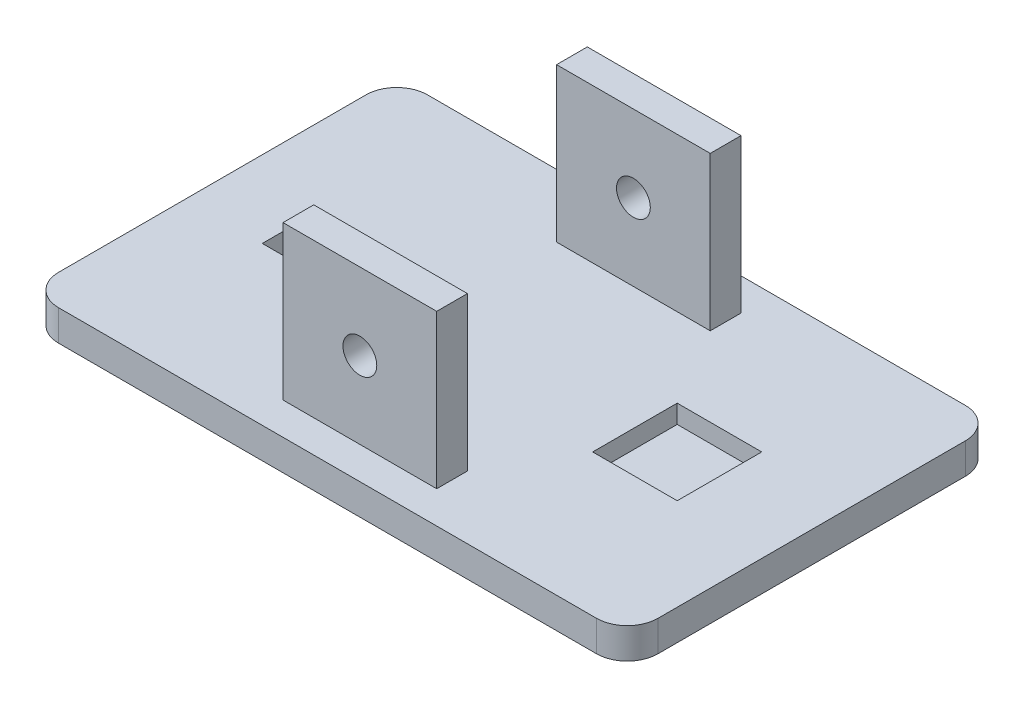
ISO-10303-21;
HEADER;
FILE_DESCRIPTION(('STEP AP214'),'2;1');
FILE_NAME('part.step','',(''),(''),'','','');
FILE_SCHEMA(('AUTOMOTIVE_DESIGN { 1 0 10303 214 1 1 1 1 }'));
ENDSEC;
DATA;
#1=APPLICATION_CONTEXT('core data for automotive mechanical design processes');
#2=APPLICATION_PROTOCOL_DEFINITION('international standard','automotive_design',2000,#1);
#3=PRODUCT_CONTEXT('',#1,'mechanical');
#4=PRODUCT('Part','Part','',(#3));
#5=PRODUCT_RELATED_PRODUCT_CATEGORY('part','',(#4));
#6=PRODUCT_DEFINITION_FORMATION('','',#4);
#7=PRODUCT_DEFINITION_CONTEXT('part definition',#1,'design');
#8=PRODUCT_DEFINITION('design','',#6,#7);
#9=PRODUCT_DEFINITION_SHAPE('','',#8);
#10=(LENGTH_UNIT() NAMED_UNIT(*) SI_UNIT(.MILLI.,.METRE.));
#11=(NAMED_UNIT(*) PLANE_ANGLE_UNIT() SI_UNIT($,.RADIAN.));
#12=(NAMED_UNIT(*) SI_UNIT($,.STERADIAN.) SOLID_ANGLE_UNIT());
#13=UNCERTAINTY_MEASURE_WITH_UNIT(LENGTH_MEASURE(1.E-05),#10,'distance_accuracy_value','');
#14=(GEOMETRIC_REPRESENTATION_CONTEXT(3) GLOBAL_UNCERTAINTY_ASSIGNED_CONTEXT((#13)) GLOBAL_UNIT_ASSIGNED_CONTEXT((#10,
#11,#12)) REPRESENTATION_CONTEXT('',''));
#15=CARTESIAN_POINT('',(0.,0.,0.));
#16=DIRECTION('',(0.,0.,1.));
#17=DIRECTION('',(1.,0.,0.));
#18=AXIS2_PLACEMENT_3D('',#15,#16,#17);
#19=CARTESIAN_POINT('',(-12.7383720930233,2.,13.3837209302326));
#20=DIRECTION('',(0.,1.,0.));
#21=DIRECTION('',(0.,0.,1.));
#22=AXIS2_PLACEMENT_3D('',#19,#20,#21);
#23=PLANE('',#22);
#24=DIRECTION('',(0.,0.,1.));
#25=VECTOR('',#24,1.);
#26=CARTESIAN_POINT('',(12.7616279069767,2.,0.633720930232558));
#27=LINE('',#26,#25);
#28=CARTESIAN_POINT('',(12.7616279069767,2.,0.633720930232558));
#29=VERTEX_POINT('',#28);
#30=CARTESIAN_POINT('',(12.7616279069767,2.,6.13372093023256));
#31=VERTEX_POINT('',#30);
#32=EDGE_CURVE('E48',#29,#31,#27,.T.);
#33=ORIENTED_EDGE('',*,*,#32,.F.);
#34=DIRECTION('',(-1.,0.,0.));
#35=VECTOR('',#34,1.);
#36=CARTESIAN_POINT('',(12.7616279069767,2.,0.633720930232558));
#37=LINE('',#36,#35);
#38=CARTESIAN_POINT('',(18.2616279069767,2.,0.633720930232558));
#39=VERTEX_POINT('',#38);
#40=EDGE_CURVE('E215',#39,#29,#37,.T.);
#41=ORIENTED_EDGE('',*,*,#40,.F.);
#42=DIRECTION('',(0.,0.,-1.));
#43=VECTOR('',#42,1.);
#44=CARTESIAN_POINT('',(18.2616279069767,2.,0.633720930232558));
#45=LINE('',#44,#43);
#46=CARTESIAN_POINT('',(18.2616279069767,2.,6.13372093023256));
#47=VERTEX_POINT('',#46);
#48=EDGE_CURVE('E218',#47,#39,#45,.T.);
#49=ORIENTED_EDGE('',*,*,#48,.F.);
#50=DIRECTION('',(1.,0.,0.));
#51=VECTOR('',#50,1.);
#52=CARTESIAN_POINT('',(12.7616279069767,2.,6.13372093023256));
#53=LINE('',#52,#51);
#54=EDGE_CURVE('E224',#31,#47,#53,.T.);
#55=ORIENTED_EDGE('',*,*,#54,.F.);
#56=EDGE_LOOP('',(#33,#41,#49,#55));
#57=FACE_BOUND('',#56,.T.);
#58=DIRECTION('',(0.,0.,1.));
#59=VECTOR('',#58,1.);
#60=CARTESIAN_POINT('',(-9.73837209302325,2.,1.63372093023256));
#61=LINE('',#60,#59);
#62=CARTESIAN_POINT('',(-9.73837209302325,2.,1.63372093023256));
#63=VERTEX_POINT('',#62);
#64=CARTESIAN_POINT('',(-9.73837209302325,2.,5.13372093023256));
#65=VERTEX_POINT('',#64);
#66=EDGE_CURVE('E56',#63,#65,#61,.T.);
#67=ORIENTED_EDGE('',*,*,#66,.F.);
#68=DIRECTION('',(-1.,0.,0.));
#69=VECTOR('',#68,1.);
#70=CARTESIAN_POINT('',(-9.73837209302325,2.,1.63372093023256));
#71=LINE('',#70,#69);
#72=CARTESIAN_POINT('',(-1.73837209302325,2.,1.63372093023256));
#73=VERTEX_POINT('',#72);
#74=EDGE_CURVE('E240',#73,#63,#71,.T.);
#75=ORIENTED_EDGE('',*,*,#74,.F.);
#76=DIRECTION('',(0.,0.,-1.));
#77=VECTOR('',#76,1.);
#78=CARTESIAN_POINT('',(-1.73837209302325,2.,1.63372093023256));
#79=LINE('',#78,#77);
#80=CARTESIAN_POINT('',(-1.73837209302325,2.,5.13372093023256));
#81=VERTEX_POINT('',#80);
#82=EDGE_CURVE('E237',#81,#73,#79,.T.);
#83=ORIENTED_EDGE('',*,*,#82,.F.);
#84=DIRECTION('',(1.,0.,0.));
#85=VECTOR('',#84,1.);
#86=CARTESIAN_POINT('',(-9.73837209302325,2.,5.13372093023256));
#87=LINE('',#86,#85);
#88=EDGE_CURVE('E234',#65,#81,#87,.T.);
#89=ORIENTED_EDGE('',*,*,#88,.F.);
#90=EDGE_LOOP('',(#67,#75,#83,#89));
#91=FACE_BOUND('',#90,.T.);
#92=CARTESIAN_POINT('',(-12.7383720930233,2.,13.3837209302326));
#93=DIRECTION('',(0.,1.,0.));
#94=DIRECTION('',(0.,0.,1.));
#95=AXIS2_PLACEMENT_3D('',#92,#93,#94);
#96=CIRCLE('',#95,2.);
#97=CARTESIAN_POINT('',(-14.7383720930233,2.,13.3837209302325));
#98=VERTEX_POINT('',#97);
#99=CARTESIAN_POINT('',(-12.7383720930232,2.,15.3837209302326));
#100=VERTEX_POINT('',#99);
#101=EDGE_CURVE('E320',#98,#100,#96,.T.);
#102=ORIENTED_EDGE('',*,*,#101,.T.);
#103=DIRECTION('',(1.,0.,0.));
#104=VECTOR('',#103,1.);
#105=CARTESIAN_POINT('',(-12.7383720930232,2.,15.3837209302326));
#106=LINE('',#105,#104);
#107=CARTESIAN_POINT('',(22.2616279069767,2.,15.3837209302326));
#108=VERTEX_POINT('',#107);
#109=EDGE_CURVE('E323',#100,#108,#106,.T.);
#110=ORIENTED_EDGE('',*,*,#109,.T.);
#111=CARTESIAN_POINT('',(22.2616279069767,2.,13.3837209302326));
#112=DIRECTION('',(0.,1.,0.));
#113=DIRECTION('',(0.,0.,1.));
#114=AXIS2_PLACEMENT_3D('',#111,#112,#113);
#115=CIRCLE('',#114,2.);
#116=CARTESIAN_POINT('',(24.2616279069767,2.,13.3837209302325));
#117=VERTEX_POINT('',#116);
#118=EDGE_CURVE('E326',#108,#117,#115,.T.);
#119=ORIENTED_EDGE('',*,*,#118,.T.);
#120=DIRECTION('',(0.,0.,-1.));
#121=VECTOR('',#120,1.);
#122=CARTESIAN_POINT('',(24.2616279069767,2.,-6.61627906976743));
#123=LINE('',#122,#121);
#124=CARTESIAN_POINT('',(24.2616279069767,2.,-6.61627906976743));
#125=VERTEX_POINT('',#124);
#126=EDGE_CURVE('E328',#117,#125,#123,.T.);
#127=ORIENTED_EDGE('',*,*,#126,.T.);
#128=CARTESIAN_POINT('',(22.2616279069767,2.,-6.61627906976744));
#129=DIRECTION('',(0.,1.,0.));
#130=DIRECTION('',(0.,0.,1.));
#131=AXIS2_PLACEMENT_3D('',#128,#129,#130);
#132=CIRCLE('',#131,2.);
#133=CARTESIAN_POINT('',(22.2616279069767,2.,-8.61627906976744));
#134=VERTEX_POINT('',#133);
#135=EDGE_CURVE('E330',#125,#134,#132,.T.);
#136=ORIENTED_EDGE('',*,*,#135,.T.);
#137=DIRECTION('',(-1.,0.,0.));
#138=VECTOR('',#137,1.);
#139=CARTESIAN_POINT('',(-12.7383720930232,2.,-8.61627906976744));
#140=LINE('',#139,#138);
#141=CARTESIAN_POINT('',(-12.7383720930232,2.,-8.61627906976744));
#142=VERTEX_POINT('',#141);
#143=EDGE_CURVE('E332',#134,#142,#140,.T.);
#144=ORIENTED_EDGE('',*,*,#143,.T.);
#145=CARTESIAN_POINT('',(-12.7383720930233,2.,-6.61627906976744));
#146=DIRECTION('',(0.,1.,0.));
#147=DIRECTION('',(0.,0.,1.));
#148=AXIS2_PLACEMENT_3D('',#145,#146,#147);
#149=CIRCLE('',#148,2.);
#150=CARTESIAN_POINT('',(-14.7383720930233,2.,-6.61627906976743));
#151=VERTEX_POINT('',#150);
#152=EDGE_CURVE('E334',#142,#151,#149,.T.);
#153=ORIENTED_EDGE('',*,*,#152,.T.);
#154=DIRECTION('',(0.,0.,1.));
#155=VECTOR('',#154,1.);
#156=CARTESIAN_POINT('',(-14.7383720930233,2.,-6.61627906976743));
#157=LINE('',#156,#155);
#158=EDGE_CURVE('E336',#151,#98,#157,.T.);
#159=ORIENTED_EDGE('',*,*,#158,.T.);
#160=EDGE_LOOP('',(#102,#110,#119,#127,#136,#144,#153,#159));
#161=FACE_BOUND('',#160,.T.);
#162=DIRECTION('',(1.,0.,0.));
#163=VECTOR('',#162,1.);
#164=CARTESIAN_POINT('',(-0.238372093023252,2.,13.2837209302326));
#165=LINE('',#164,#163);
#166=CARTESIAN_POINT('',(-0.238372093023252,2.,13.2837209302326));
#167=VERTEX_POINT('',#166);
#168=CARTESIAN_POINT('',(9.76162790697675,2.,13.2837209302326));
#169=VERTEX_POINT('',#168);
#170=EDGE_CURVE('E304',#167,#169,#165,.T.);
#171=ORIENTED_EDGE('',*,*,#170,.F.);
#172=DIRECTION('',(0.,0.,1.));
#173=VECTOR('',#172,1.);
#174=CARTESIAN_POINT('',(-0.238372093023253,2.,11.2837209302326));
#175=LINE('',#174,#173);
#176=CARTESIAN_POINT('',(-0.238372093023253,2.,11.2837209302326));
#177=VERTEX_POINT('',#176);
#178=EDGE_CURVE('E290',#177,#167,#175,.T.);
#179=ORIENTED_EDGE('',*,*,#178,.F.);
#180=DIRECTION('',(-1.,0.,0.));
#181=VECTOR('',#180,1.);
#182=CARTESIAN_POINT('',(-0.238372093023253,2.,11.2837209302326));
#183=LINE('',#182,#181);
#184=CARTESIAN_POINT('',(9.76162790697675,2.,11.2837209302326));
#185=VERTEX_POINT('',#184);
#186=EDGE_CURVE('E295',#185,#177,#183,.T.);
#187=ORIENTED_EDGE('',*,*,#186,.F.);
#188=DIRECTION('',(0.,0.,-1.));
#189=VECTOR('',#188,1.);
#190=CARTESIAN_POINT('',(9.76162790697675,2.,11.2837209302326));
#191=LINE('',#190,#189);
#192=EDGE_CURVE('E306',#169,#185,#191,.T.);
#193=ORIENTED_EDGE('',*,*,#192,.F.);
#194=EDGE_LOOP('',(#171,#179,#187,#193));
#195=FACE_BOUND('',#194,.T.);
#196=DIRECTION('',(0.,0.,-1.));
#197=VECTOR('',#196,1.);
#198=CARTESIAN_POINT('',(9.76162790697675,2.,-4.51627906976744));
#199=LINE('',#198,#197);
#200=CARTESIAN_POINT('',(9.76162790697675,2.,-4.51627906976744));
#201=VERTEX_POINT('',#200);
#202=CARTESIAN_POINT('',(9.76162790697675,2.,-6.51627906976744));
#203=VERTEX_POINT('',#202);
#204=EDGE_CURVE('E275',#201,#203,#199,.T.);
#205=ORIENTED_EDGE('',*,*,#204,.F.);
#206=DIRECTION('',(1.,0.,0.));
#207=VECTOR('',#206,1.);
#208=CARTESIAN_POINT('',(-0.238372093023253,2.,-4.51627906976744));
#209=LINE('',#208,#207);
#210=CARTESIAN_POINT('',(-0.238372093023253,2.,-4.51627906976744));
#211=VERTEX_POINT('',#210);
#212=EDGE_CURVE('E261',#211,#201,#209,.T.);
#213=ORIENTED_EDGE('',*,*,#212,.F.);
#214=DIRECTION('',(0.,0.,1.));
#215=VECTOR('',#214,1.);
#216=CARTESIAN_POINT('',(-0.238372093023253,2.,-4.51627906976744));
#217=LINE('',#216,#215);
#218=CARTESIAN_POINT('',(-0.238372093023252,2.,-6.51627906976744));
#219=VERTEX_POINT('',#218);
#220=EDGE_CURVE('E266',#219,#211,#217,.T.);
#221=ORIENTED_EDGE('',*,*,#220,.F.);
#222=DIRECTION('',(-1.,0.,0.));
#223=VECTOR('',#222,1.);
#224=CARTESIAN_POINT('',(-0.238372093023252,2.,-6.51627906976744));
#225=LINE('',#224,#223);
#226=EDGE_CURVE('E277',#203,#219,#225,.T.);
#227=ORIENTED_EDGE('',*,*,#226,.F.);
#228=EDGE_LOOP('',(#205,#213,#221,#227));
#229=FACE_BOUND('',#228,.T.);
#230=ADVANCED_FACE('F33',(#57,#91,#161,#195,#229),#23,.T.);
#231=CARTESIAN_POINT('',(-12.7383720930233,2.,13.3837209302326));
#232=DIRECTION('',(0.,-1.,0.));
#233=DIRECTION('',(0.,0.,-1.));
#234=AXIS2_PLACEMENT_3D('',#231,#232,#233);
#235=CYLINDRICAL_SURFACE('',#234,2.);
#236=CARTESIAN_POINT('',(-12.7383720930233,0.,13.3837209302326));
#237=DIRECTION('',(0.,1.,0.));
#238=DIRECTION('',(0.,0.,1.));
#239=AXIS2_PLACEMENT_3D('',#236,#237,#238);
#240=CIRCLE('',#239,2.);
#241=CARTESIAN_POINT('',(-14.7383720930233,0.,13.3837209302325));
#242=VERTEX_POINT('',#241);
#243=CARTESIAN_POINT('',(-12.7383720930232,0.,15.3837209302326));
#244=VERTEX_POINT('',#243);
#245=EDGE_CURVE('E319',#242,#244,#240,.T.);
#246=ORIENTED_EDGE('',*,*,#245,.T.);
#247=DIRECTION('',(0.,-1.,0.));
#248=VECTOR('',#247,1.);
#249=CARTESIAN_POINT('',(-12.7383720930232,2.,15.3837209302326));
#250=LINE('',#249,#248);
#251=EDGE_CURVE('E374',#100,#244,#250,.T.);
#252=ORIENTED_EDGE('',*,*,#251,.F.);
#253=ORIENTED_EDGE('',*,*,#101,.F.);
#254=DIRECTION('',(0.,-1.,0.));
#255=VECTOR('',#254,1.);
#256=CARTESIAN_POINT('',(-14.7383720930233,2.,13.3837209302325));
#257=LINE('',#256,#255);
#258=EDGE_CURVE('E338',#98,#242,#257,.T.);
#259=ORIENTED_EDGE('',*,*,#258,.T.);
#260=EDGE_LOOP('',(#246,#252,#253,#259));
#261=FACE_BOUND('',#260,.T.);
#262=ADVANCED_FACE('F35',(#261),#235,.T.);
#263=CARTESIAN_POINT('',(-12.7383720930232,2.,15.3837209302326));
#264=DIRECTION('',(0.,0.,-1.));
#265=DIRECTION('',(-1.,0.,0.));
#266=AXIS2_PLACEMENT_3D('',#263,#264,#265);
#267=PLANE('',#266);
#268=DIRECTION('',(1.,0.,0.));
#269=VECTOR('',#268,1.);
#270=CARTESIAN_POINT('',(-12.7383720930232,0.,15.3837209302326));
#271=LINE('',#270,#269);
#272=CARTESIAN_POINT('',(22.2616279069767,0.,15.3837209302326));
#273=VERTEX_POINT('',#272);
#274=EDGE_CURVE('E341',#244,#273,#271,.T.);
#275=ORIENTED_EDGE('',*,*,#274,.T.);
#276=DIRECTION('',(0.,-1.,0.));
#277=VECTOR('',#276,1.);
#278=CARTESIAN_POINT('',(22.2616279069767,2.,15.3837209302326));
#279=LINE('',#278,#277);
#280=EDGE_CURVE('E371',#108,#273,#279,.T.);
#281=ORIENTED_EDGE('',*,*,#280,.F.);
#282=ORIENTED_EDGE('',*,*,#109,.F.);
#283=ORIENTED_EDGE('',*,*,#251,.T.);
#284=EDGE_LOOP('',(#275,#281,#282,#283));
#285=FACE_BOUND('',#284,.T.);
#286=ADVANCED_FACE('F421',(#285),#267,.F.);
#287=CARTESIAN_POINT('',(22.2616279069767,2.,13.3837209302326));
#288=DIRECTION('',(0.,-1.,0.));
#289=DIRECTION('',(0.,0.,-1.));
#290=AXIS2_PLACEMENT_3D('',#287,#288,#289);
#291=CYLINDRICAL_SURFACE('',#290,2.);
#292=CARTESIAN_POINT('',(22.2616279069767,0.,13.3837209302326));
#293=DIRECTION('',(0.,1.,0.));
#294=DIRECTION('',(0.,0.,1.));
#295=AXIS2_PLACEMENT_3D('',#292,#293,#294);
#296=CIRCLE('',#295,2.);
#297=CARTESIAN_POINT('',(24.2616279069767,0.,13.3837209302325));
#298=VERTEX_POINT('',#297);
#299=EDGE_CURVE('E343',#273,#298,#296,.T.);
#300=ORIENTED_EDGE('',*,*,#299,.T.);
#301=DIRECTION('',(0.,-1.,0.));
#302=VECTOR('',#301,1.);
#303=CARTESIAN_POINT('',(24.2616279069767,2.,13.3837209302325));
#304=LINE('',#303,#302);
#305=EDGE_CURVE('E368',#117,#298,#304,.T.);
#306=ORIENTED_EDGE('',*,*,#305,.F.);
#307=ORIENTED_EDGE('',*,*,#118,.F.);
#308=ORIENTED_EDGE('',*,*,#280,.T.);
#309=EDGE_LOOP('',(#300,#306,#307,#308));
#310=FACE_BOUND('',#309,.T.);
#311=ADVANCED_FACE('F448',(#310),#291,.T.);
#312=CARTESIAN_POINT('',(24.2616279069767,2.,-6.61627906976743));
#313=DIRECTION('',(-1.,0.,0.));
#314=DIRECTION('',(0.,0.,1.));
#315=AXIS2_PLACEMENT_3D('',#312,#313,#314);
#316=PLANE('',#315);
#317=DIRECTION('',(0.,0.,-1.));
#318=VECTOR('',#317,1.);
#319=CARTESIAN_POINT('',(24.2616279069767,0.,-6.61627906976743));
#320=LINE('',#319,#318);
#321=CARTESIAN_POINT('',(24.2616279069767,0.,-6.61627906976743));
#322=VERTEX_POINT('',#321);
#323=EDGE_CURVE('E345',#298,#322,#320,.T.);
#324=ORIENTED_EDGE('',*,*,#323,.T.);
#325=DIRECTION('',(0.,-1.,0.));
#326=VECTOR('',#325,1.);
#327=CARTESIAN_POINT('',(24.2616279069767,2.,-6.61627906976743));
#328=LINE('',#327,#326);
#329=EDGE_CURVE('E365',#125,#322,#328,.T.);
#330=ORIENTED_EDGE('',*,*,#329,.F.);
#331=ORIENTED_EDGE('',*,*,#126,.F.);
#332=ORIENTED_EDGE('',*,*,#305,.T.);
#333=EDGE_LOOP('',(#324,#330,#331,#332));
#334=FACE_BOUND('',#333,.T.);
#335=ADVANCED_FACE('F444',(#334),#316,.F.);
#336=CARTESIAN_POINT('',(22.2616279069767,2.,-6.61627906976744));
#337=DIRECTION('',(0.,-1.,0.));
#338=DIRECTION('',(0.,0.,-1.));
#339=AXIS2_PLACEMENT_3D('',#336,#337,#338);
#340=CYLINDRICAL_SURFACE('',#339,2.);
#341=CARTESIAN_POINT('',(22.2616279069767,0.,-6.61627906976744));
#342=DIRECTION('',(0.,1.,0.));
#343=DIRECTION('',(0.,0.,1.));
#344=AXIS2_PLACEMENT_3D('',#341,#342,#343);
#345=CIRCLE('',#344,2.);
#346=CARTESIAN_POINT('',(22.2616279069767,0.,-8.61627906976744));
#347=VERTEX_POINT('',#346);
#348=EDGE_CURVE('E347',#322,#347,#345,.T.);
#349=ORIENTED_EDGE('',*,*,#348,.T.);
#350=DIRECTION('',(0.,-1.,0.));
#351=VECTOR('',#350,1.);
#352=CARTESIAN_POINT('',(22.2616279069767,2.,-8.61627906976744));
#353=LINE('',#352,#351);
#354=EDGE_CURVE('E362',#134,#347,#353,.T.);
#355=ORIENTED_EDGE('',*,*,#354,.F.);
#356=ORIENTED_EDGE('',*,*,#135,.F.);
#357=ORIENTED_EDGE('',*,*,#329,.T.);
#358=EDGE_LOOP('',(#349,#355,#356,#357));
#359=FACE_BOUND('',#358,.T.);
#360=ADVANCED_FACE('F440',(#359),#340,.T.);
#361=CARTESIAN_POINT('',(-12.7383720930232,2.,-8.61627906976744));
#362=DIRECTION('',(0.,0.,1.));
#363=DIRECTION('',(1.,0.,0.));
#364=AXIS2_PLACEMENT_3D('',#361,#362,#363);
#365=PLANE('',#364);
#366=DIRECTION('',(-1.,0.,0.));
#367=VECTOR('',#366,1.);
#368=CARTESIAN_POINT('',(-12.7383720930232,0.,-8.61627906976744));
#369=LINE('',#368,#367);
#370=CARTESIAN_POINT('',(-12.7383720930232,0.,-8.61627906976744));
#371=VERTEX_POINT('',#370);
#372=EDGE_CURVE('E349',#347,#371,#369,.T.);
#373=ORIENTED_EDGE('',*,*,#372,.T.);
#374=DIRECTION('',(0.,-1.,0.));
#375=VECTOR('',#374,1.);
#376=CARTESIAN_POINT('',(-12.7383720930232,2.,-8.61627906976744));
#377=LINE('',#376,#375);
#378=EDGE_CURVE('E359',#142,#371,#377,.T.);
#379=ORIENTED_EDGE('',*,*,#378,.F.);
#380=ORIENTED_EDGE('',*,*,#143,.F.);
#381=ORIENTED_EDGE('',*,*,#354,.T.);
#382=EDGE_LOOP('',(#373,#379,#380,#381));
#383=FACE_BOUND('',#382,.T.);
#384=ADVANCED_FACE('F436',(#383),#365,.F.);
#385=CARTESIAN_POINT('',(-12.7383720930233,2.,-6.61627906976744));
#386=DIRECTION('',(0.,-1.,0.));
#387=DIRECTION('',(0.,0.,-1.));
#388=AXIS2_PLACEMENT_3D('',#385,#386,#387);
#389=CYLINDRICAL_SURFACE('',#388,2.);
#390=CARTESIAN_POINT('',(-12.7383720930233,0.,-6.61627906976744));
#391=DIRECTION('',(0.,1.,0.));
#392=DIRECTION('',(0.,0.,1.));
#393=AXIS2_PLACEMENT_3D('',#390,#391,#392);
#394=CIRCLE('',#393,2.);
#395=CARTESIAN_POINT('',(-14.7383720930233,0.,-6.61627906976743));
#396=VERTEX_POINT('',#395);
#397=EDGE_CURVE('E351',#371,#396,#394,.T.);
#398=ORIENTED_EDGE('',*,*,#397,.T.);
#399=DIRECTION('',(0.,-1.,0.));
#400=VECTOR('',#399,1.);
#401=CARTESIAN_POINT('',(-14.7383720930233,2.,-6.61627906976743));
#402=LINE('',#401,#400);
#403=EDGE_CURVE('E356',#151,#396,#402,.T.);
#404=ORIENTED_EDGE('',*,*,#403,.F.);
#405=ORIENTED_EDGE('',*,*,#152,.F.);
#406=ORIENTED_EDGE('',*,*,#378,.T.);
#407=EDGE_LOOP('',(#398,#404,#405,#406));
#408=FACE_BOUND('',#407,.T.);
#409=ADVANCED_FACE('F432',(#408),#389,.T.);
#410=CARTESIAN_POINT('',(-14.7383720930233,2.,-6.61627906976743));
#411=DIRECTION('',(1.,0.,0.));
#412=DIRECTION('',(0.,0.,-1.));
#413=AXIS2_PLACEMENT_3D('',#410,#411,#412);
#414=PLANE('',#413);
#415=DIRECTION('',(0.,0.,1.));
#416=VECTOR('',#415,1.);
#417=CARTESIAN_POINT('',(-14.7383720930233,0.,-6.61627906976743));
#418=LINE('',#417,#416);
#419=EDGE_CURVE('E324',#396,#242,#418,.T.);
#420=ORIENTED_EDGE('',*,*,#419,.T.);
#421=ORIENTED_EDGE('',*,*,#258,.F.);
#422=ORIENTED_EDGE('',*,*,#158,.F.);
#423=ORIENTED_EDGE('',*,*,#403,.T.);
#424=EDGE_LOOP('',(#420,#421,#422,#423));
#425=FACE_BOUND('',#424,.T.);
#426=ADVANCED_FACE('F429',(#425),#414,.F.);
#427=CARTESIAN_POINT('',(-12.7383720930233,0.,13.3837209302326));
#428=DIRECTION('',(0.,1.,0.));
#429=DIRECTION('',(0.,0.,1.));
#430=AXIS2_PLACEMENT_3D('',#427,#428,#429);
#431=PLANE('',#430);
#432=DIRECTION('',(-1.,0.,0.));
#433=VECTOR('',#432,1.);
#434=CARTESIAN_POINT('',(-12.7383720930233,0.,1.63372093023256));
#435=LINE('',#434,#433);
#436=CARTESIAN_POINT('',(-1.73837209302325,0.,1.63372093023256));
#437=VERTEX_POINT('',#436);
#438=CARTESIAN_POINT('',(-9.73837209302325,0.,1.63372093023256));
#439=VERTEX_POINT('',#438);
#440=EDGE_CURVE('E41',#437,#439,#435,.T.);
#441=ORIENTED_EDGE('',*,*,#440,.T.);
#442=DIRECTION('',(0.,0.,1.));
#443=VECTOR('',#442,1.);
#444=CARTESIAN_POINT('',(-9.73837209302325,0.,13.3837209302326));
#445=LINE('',#444,#443);
#446=CARTESIAN_POINT('',(-9.73837209302325,0.,5.13372093023256));
#447=VERTEX_POINT('',#446);
#448=EDGE_CURVE('E11',#439,#447,#445,.T.);
#449=ORIENTED_EDGE('',*,*,#448,.T.);
#450=DIRECTION('',(1.,0.,0.));
#451=VECTOR('',#450,1.);
#452=CARTESIAN_POINT('',(-12.7383720930233,0.,5.13372093023256));
#453=LINE('',#452,#451);
#454=CARTESIAN_POINT('',(-1.73837209302325,0.,5.13372093023256));
#455=VERTEX_POINT('',#454);
#456=EDGE_CURVE('E377',#447,#455,#453,.T.);
#457=ORIENTED_EDGE('',*,*,#456,.T.);
#458=DIRECTION('',(0.,0.,-1.));
#459=VECTOR('',#458,1.);
#460=CARTESIAN_POINT('',(-1.73837209302325,0.,13.3837209302326));
#461=LINE('',#460,#459);
#462=EDGE_CURVE('E382',#455,#437,#461,.T.);
#463=ORIENTED_EDGE('',*,*,#462,.T.);
#464=EDGE_LOOP('',(#441,#449,#457,#463));
#465=FACE_BOUND('',#464,.T.);
#466=ORIENTED_EDGE('',*,*,#245,.F.);
#467=ORIENTED_EDGE('',*,*,#419,.F.);
#468=ORIENTED_EDGE('',*,*,#397,.F.);
#469=ORIENTED_EDGE('',*,*,#372,.F.);
#470=ORIENTED_EDGE('',*,*,#348,.F.);
#471=ORIENTED_EDGE('',*,*,#323,.F.);
#472=ORIENTED_EDGE('',*,*,#299,.F.);
#473=ORIENTED_EDGE('',*,*,#274,.F.);
#474=EDGE_LOOP('',(#466,#467,#468,#469,#470,#471,#472,#473));
#475=FACE_BOUND('',#474,.T.);
#476=ADVANCED_FACE('F386',(#465,#475),#431,.F.);
#477=CARTESIAN_POINT('',(-0.238372093023253,12.,11.2837209302326));
#478=DIRECTION('',(1.,0.,0.));
#479=DIRECTION('',(0.,0.,-1.));
#480=AXIS2_PLACEMENT_3D('',#477,#478,#479);
#481=PLANE('',#480);
#482=ORIENTED_EDGE('',*,*,#178,.T.);
#483=DIRECTION('',(0.,-1.,0.));
#484=VECTOR('',#483,1.);
#485=CARTESIAN_POINT('',(-0.238372093023252,12.,13.2837209302326));
#486=LINE('',#485,#484);
#487=CARTESIAN_POINT('',(-0.238372093023252,12.,13.2837209302326));
#488=VERTEX_POINT('',#487);
#489=EDGE_CURVE('E317',#488,#167,#486,.T.);
#490=ORIENTED_EDGE('',*,*,#489,.F.);
#491=DIRECTION('',(0.,0.,1.));
#492=VECTOR('',#491,1.);
#493=CARTESIAN_POINT('',(-0.238372093023253,12.,11.2837209302326));
#494=LINE('',#493,#492);
#495=CARTESIAN_POINT('',(-0.238372093023253,12.,11.2837209302326));
#496=VERTEX_POINT('',#495);
#497=EDGE_CURVE('E291',#496,#488,#494,.T.);
#498=ORIENTED_EDGE('',*,*,#497,.F.);
#499=DIRECTION('',(0.,-1.,0.));
#500=VECTOR('',#499,1.);
#501=CARTESIAN_POINT('',(-0.238372093023253,12.,11.2837209302326));
#502=LINE('',#501,#500);
#503=EDGE_CURVE('E301',#496,#177,#502,.T.);
#504=ORIENTED_EDGE('',*,*,#503,.T.);
#505=EDGE_LOOP('',(#482,#490,#498,#504));
#506=FACE_BOUND('',#505,.T.);
#507=ADVANCED_FACE('F425',(#506),#481,.F.);
#508=CARTESIAN_POINT('',(-0.238372093023252,12.,13.2837209302326));
#509=DIRECTION('',(0.,0.,-1.));
#510=DIRECTION('',(-1.,0.,0.));
#511=AXIS2_PLACEMENT_3D('',#508,#509,#510);
#512=PLANE('',#511);
#513=CARTESIAN_POINT('',(4.76162790697675,7.,13.2837209302326));
#514=DIRECTION('',(0.,0.,1.));
#515=DIRECTION('',(1.,0.,0.));
#516=AXIS2_PLACEMENT_3D('',#513,#514,#515);
#517=CIRCLE('',#516,1.1);
#518=CARTESIAN_POINT('',(5.86162790697675,7.,13.2837209302326));
#519=VERTEX_POINT('',#518);
#520=EDGE_CURVE('E246',#519,#519,#517,.T.);
#521=ORIENTED_EDGE('',*,*,#520,.F.);
#522=EDGE_LOOP('',(#521));
#523=FACE_BOUND('',#522,.T.);
#524=ORIENTED_EDGE('',*,*,#170,.T.);
#525=DIRECTION('',(0.,-1.,0.));
#526=VECTOR('',#525,1.);
#527=CARTESIAN_POINT('',(9.76162790697675,12.,13.2837209302326));
#528=LINE('',#527,#526);
#529=CARTESIAN_POINT('',(9.76162790697675,12.,13.2837209302326));
#530=VERTEX_POINT('',#529);
#531=EDGE_CURVE('E314',#530,#169,#528,.T.);
#532=ORIENTED_EDGE('',*,*,#531,.F.);
#533=DIRECTION('',(1.,0.,0.));
#534=VECTOR('',#533,1.);
#535=CARTESIAN_POINT('',(-0.238372093023252,12.,13.2837209302326));
#536=LINE('',#535,#534);
#537=EDGE_CURVE('E294',#488,#530,#536,.T.);
#538=ORIENTED_EDGE('',*,*,#537,.F.);
#539=ORIENTED_EDGE('',*,*,#489,.T.);
#540=EDGE_LOOP('',(#524,#532,#538,#539));
#541=FACE_BOUND('',#540,.T.);
#542=ADVANCED_FACE('F529',(#523,#541),#512,.F.);
#543=CARTESIAN_POINT('',(9.76162790697675,12.,11.2837209302326));
#544=DIRECTION('',(-1.,0.,0.));
#545=DIRECTION('',(0.,0.,1.));
#546=AXIS2_PLACEMENT_3D('',#543,#544,#545);
#547=PLANE('',#546);
#548=ORIENTED_EDGE('',*,*,#192,.T.);
#549=DIRECTION('',(0.,-1.,0.));
#550=VECTOR('',#549,1.);
#551=CARTESIAN_POINT('',(9.76162790697675,12.,11.2837209302326));
#552=LINE('',#551,#550);
#553=CARTESIAN_POINT('',(9.76162790697675,12.,11.2837209302326));
#554=VERTEX_POINT('',#553);
#555=EDGE_CURVE('E312',#554,#185,#552,.T.);
#556=ORIENTED_EDGE('',*,*,#555,.F.);
#557=DIRECTION('',(0.,0.,-1.));
#558=VECTOR('',#557,1.);
#559=CARTESIAN_POINT('',(9.76162790697675,12.,11.2837209302326));
#560=LINE('',#559,#558);
#561=EDGE_CURVE('E297',#530,#554,#560,.T.);
#562=ORIENTED_EDGE('',*,*,#561,.F.);
#563=ORIENTED_EDGE('',*,*,#531,.T.);
#564=EDGE_LOOP('',(#548,#556,#562,#563));
#565=FACE_BOUND('',#564,.T.);
#566=ADVANCED_FACE('F526',(#565),#547,.F.);
#567=CARTESIAN_POINT('',(-0.238372093023253,12.,11.2837209302326));
#568=DIRECTION('',(0.,0.,1.));
#569=DIRECTION('',(1.,0.,0.));
#570=AXIS2_PLACEMENT_3D('',#567,#568,#569);
#571=PLANE('',#570);
#572=CARTESIAN_POINT('',(4.76162790697675,7.,11.2837209302326));
#573=DIRECTION('',(0.,0.,1.));
#574=DIRECTION('',(1.,0.,0.));
#575=AXIS2_PLACEMENT_3D('',#572,#573,#574);
#576=CIRCLE('',#575,1.1);
#577=CARTESIAN_POINT('',(5.86162790697675,7.,11.2837209302326));
#578=VERTEX_POINT('',#577);
#579=EDGE_CURVE('E258',#578,#578,#576,.T.);
#580=ORIENTED_EDGE('',*,*,#579,.T.);
#581=EDGE_LOOP('',(#580));
#582=FACE_BOUND('',#581,.T.);
#583=ORIENTED_EDGE('',*,*,#186,.T.);
#584=ORIENTED_EDGE('',*,*,#503,.F.);
#585=DIRECTION('',(-1.,0.,0.));
#586=VECTOR('',#585,1.);
#587=CARTESIAN_POINT('',(-0.238372093023253,12.,11.2837209302326));
#588=LINE('',#587,#586);
#589=EDGE_CURVE('E299',#554,#496,#588,.T.);
#590=ORIENTED_EDGE('',*,*,#589,.F.);
#591=ORIENTED_EDGE('',*,*,#555,.T.);
#592=EDGE_LOOP('',(#583,#584,#590,#591));
#593=FACE_BOUND('',#592,.T.);
#594=ADVANCED_FACE('F522',(#582,#593),#571,.F.);
#595=CARTESIAN_POINT('',(0.,12.,0.));
#596=DIRECTION('',(0.,1.,0.));
#597=DIRECTION('',(0.,0.,1.));
#598=AXIS2_PLACEMENT_3D('',#595,#596,#597);
#599=PLANE('',#598);
#600=ORIENTED_EDGE('',*,*,#497,.T.);
#601=ORIENTED_EDGE('',*,*,#537,.T.);
#602=ORIENTED_EDGE('',*,*,#561,.T.);
#603=ORIENTED_EDGE('',*,*,#589,.T.);
#604=EDGE_LOOP('',(#600,#601,#602,#603));
#605=FACE_BOUND('',#604,.T.);
#606=ADVANCED_FACE('F518',(#605),#599,.T.);
#607=CARTESIAN_POINT('',(-0.238372093023253,12.,-4.51627906976744));
#608=DIRECTION('',(0.,0.,-1.));
#609=DIRECTION('',(-1.,0.,0.));
#610=AXIS2_PLACEMENT_3D('',#607,#608,#609);
#611=PLANE('',#610);
#612=CARTESIAN_POINT('',(4.76162790697675,7.,-4.51627906976744));
#613=DIRECTION('',(0.,0.,-1.));
#614=DIRECTION('',(-1.,0.,0.));
#615=AXIS2_PLACEMENT_3D('',#612,#613,#614);
#616=CIRCLE('',#615,1.1);
#617=CARTESIAN_POINT('',(3.66162790697675,7.,-4.51627906976744));
#618=VERTEX_POINT('',#617);
#619=EDGE_CURVE('E255',#618,#618,#616,.T.);
#620=ORIENTED_EDGE('',*,*,#619,.T.);
#621=EDGE_LOOP('',(#620));
#622=FACE_BOUND('',#621,.T.);
#623=ORIENTED_EDGE('',*,*,#212,.T.);
#624=DIRECTION('',(0.,-1.,0.));
#625=VECTOR('',#624,1.);
#626=CARTESIAN_POINT('',(9.76162790697675,12.,-4.51627906976744));
#627=LINE('',#626,#625);
#628=CARTESIAN_POINT('',(9.76162790697675,12.,-4.51627906976744));
#629=VERTEX_POINT('',#628);
#630=EDGE_CURVE('E288',#629,#201,#627,.T.);
#631=ORIENTED_EDGE('',*,*,#630,.F.);
#632=DIRECTION('',(1.,0.,0.));
#633=VECTOR('',#632,1.);
#634=CARTESIAN_POINT('',(-0.238372093023253,12.,-4.51627906976744));
#635=LINE('',#634,#633);
#636=CARTESIAN_POINT('',(-0.238372093023253,12.,-4.51627906976744));
#637=VERTEX_POINT('',#636);
#638=EDGE_CURVE('E262',#637,#629,#635,.T.);
#639=ORIENTED_EDGE('',*,*,#638,.F.);
#640=DIRECTION('',(0.,-1.,0.));
#641=VECTOR('',#640,1.);
#642=CARTESIAN_POINT('',(-0.238372093023253,12.,-4.51627906976744));
#643=LINE('',#642,#641);
#644=EDGE_CURVE('E272',#637,#211,#643,.T.);
#645=ORIENTED_EDGE('',*,*,#644,.T.);
#646=EDGE_LOOP('',(#623,#631,#639,#645));
#647=FACE_BOUND('',#646,.T.);
#648=ADVANCED_FACE('F501',(#622,#647),#611,.F.);
#649=CARTESIAN_POINT('',(9.76162790697675,12.,-4.51627906976744));
#650=DIRECTION('',(-1.,0.,0.));
#651=DIRECTION('',(0.,0.,1.));
#652=AXIS2_PLACEMENT_3D('',#649,#650,#651);
#653=PLANE('',#652);
#654=ORIENTED_EDGE('',*,*,#204,.T.);
#655=DIRECTION('',(0.,-1.,0.));
#656=VECTOR('',#655,1.);
#657=CARTESIAN_POINT('',(9.76162790697675,12.,-6.51627906976744));
#658=LINE('',#657,#656);
#659=CARTESIAN_POINT('',(9.76162790697675,12.,-6.51627906976744));
#660=VERTEX_POINT('',#659);
#661=EDGE_CURVE('E285',#660,#203,#658,.T.);
#662=ORIENTED_EDGE('',*,*,#661,.F.);
#663=DIRECTION('',(0.,0.,-1.));
#664=VECTOR('',#663,1.);
#665=CARTESIAN_POINT('',(9.76162790697675,12.,-4.51627906976744));
#666=LINE('',#665,#664);
#667=EDGE_CURVE('E265',#629,#660,#666,.T.);
#668=ORIENTED_EDGE('',*,*,#667,.F.);
#669=ORIENTED_EDGE('',*,*,#630,.T.);
#670=EDGE_LOOP('',(#654,#662,#668,#669));
#671=FACE_BOUND('',#670,.T.);
#672=ADVANCED_FACE('F489',(#671),#653,.F.);
#673=CARTESIAN_POINT('',(-0.238372093023252,12.,-6.51627906976744));
#674=DIRECTION('',(0.,0.,1.));
#675=DIRECTION('',(1.,0.,0.));
#676=AXIS2_PLACEMENT_3D('',#673,#674,#675);
#677=PLANE('',#676);
#678=CARTESIAN_POINT('',(4.76162790697675,7.,-6.51627906976744));
#679=DIRECTION('',(0.,0.,1.));
#680=DIRECTION('',(1.,0.,0.));
#681=AXIS2_PLACEMENT_3D('',#678,#679,#680);
#682=CIRCLE('',#681,1.1);
#683=CARTESIAN_POINT('',(5.86162790697675,7.,-6.51627906976744));
#684=VERTEX_POINT('',#683);
#685=EDGE_CURVE('E254',#684,#684,#682,.T.);
#686=ORIENTED_EDGE('',*,*,#685,.T.);
#687=EDGE_LOOP('',(#686));
#688=FACE_BOUND('',#687,.T.);
#689=ORIENTED_EDGE('',*,*,#226,.T.);
#690=DIRECTION('',(0.,-1.,0.));
#691=VECTOR('',#690,1.);
#692=CARTESIAN_POINT('',(-0.238372093023252,12.,-6.51627906976744));
#693=LINE('',#692,#691);
#694=CARTESIAN_POINT('',(-0.238372093023252,12.,-6.51627906976744));
#695=VERTEX_POINT('',#694);
#696=EDGE_CURVE('E283',#695,#219,#693,.T.);
#697=ORIENTED_EDGE('',*,*,#696,.F.);
#698=DIRECTION('',(-1.,0.,0.));
#699=VECTOR('',#698,1.);
#700=CARTESIAN_POINT('',(-0.238372093023252,12.,-6.51627906976744));
#701=LINE('',#700,#699);
#702=EDGE_CURVE('E268',#660,#695,#701,.T.);
#703=ORIENTED_EDGE('',*,*,#702,.F.);
#704=ORIENTED_EDGE('',*,*,#661,.T.);
#705=EDGE_LOOP('',(#689,#697,#703,#704));
#706=FACE_BOUND('',#705,.T.);
#707=ADVANCED_FACE('F493',(#688,#706),#677,.F.);
#708=CARTESIAN_POINT('',(-0.238372093023253,12.,-4.51627906976744));
#709=DIRECTION('',(1.,0.,0.));
#710=DIRECTION('',(0.,0.,-1.));
#711=AXIS2_PLACEMENT_3D('',#708,#709,#710);
#712=PLANE('',#711);
#713=ORIENTED_EDGE('',*,*,#220,.T.);
#714=ORIENTED_EDGE('',*,*,#644,.F.);
#715=DIRECTION('',(0.,0.,1.));
#716=VECTOR('',#715,1.);
#717=CARTESIAN_POINT('',(-0.238372093023253,12.,-4.51627906976744));
#718=LINE('',#717,#716);
#719=EDGE_CURVE('E270',#695,#637,#718,.T.);
#720=ORIENTED_EDGE('',*,*,#719,.F.);
#721=ORIENTED_EDGE('',*,*,#696,.T.);
#722=EDGE_LOOP('',(#713,#714,#720,#721));
#723=FACE_BOUND('',#722,.T.);
#724=ADVANCED_FACE('F503',(#723),#712,.F.);
#725=CARTESIAN_POINT('',(0.,12.,0.));
#726=DIRECTION('',(0.,1.,0.));
#727=DIRECTION('',(0.,0.,1.));
#728=AXIS2_PLACEMENT_3D('',#725,#726,#727);
#729=PLANE('',#728);
#730=ORIENTED_EDGE('',*,*,#638,.T.);
#731=ORIENTED_EDGE('',*,*,#667,.T.);
#732=ORIENTED_EDGE('',*,*,#702,.T.);
#733=ORIENTED_EDGE('',*,*,#719,.T.);
#734=EDGE_LOOP('',(#730,#731,#732,#733));
#735=FACE_BOUND('',#734,.T.);
#736=ADVANCED_FACE('F497',(#735),#729,.T.);
#737=CARTESIAN_POINT('',(4.76162790697675,7.,-16.7162790697674));
#738=DIRECTION('',(0.,0.,1.));
#739=DIRECTION('',(1.,0.,0.));
#740=AXIS2_PLACEMENT_3D('',#737,#738,#739);
#741=CYLINDRICAL_SURFACE('',#740,1.1);
#742=ORIENTED_EDGE('',*,*,#685,.F.);
#743=EDGE_LOOP('',(#742));
#744=FACE_BOUND('',#743,.T.);
#745=ORIENTED_EDGE('',*,*,#619,.F.);
#746=EDGE_LOOP('',(#745));
#747=FACE_BOUND('',#746,.T.);
#748=ADVANCED_FACE('F411',(#744,#747),#741,.F.);
#749=ORIENTED_EDGE('',*,*,#520,.T.);
#750=EDGE_LOOP('',(#749));
#751=FACE_BOUND('',#750,.T.);
#752=ORIENTED_EDGE('',*,*,#579,.F.);
#753=EDGE_LOOP('',(#752));
#754=FACE_BOUND('',#753,.T.);
#755=ADVANCED_FACE('F404',(#751,#754),#741,.F.);
#756=CARTESIAN_POINT('',(-9.73837209302325,-28.,1.63372093023256));
#757=DIRECTION('',(-1.,0.,0.));
#758=DIRECTION('',(0.,0.,1.));
#759=AXIS2_PLACEMENT_3D('',#756,#757,#758);
#760=PLANE('',#759);
#761=DIRECTION('',(0.,1.,0.));
#762=VECTOR('',#761,1.);
#763=CARTESIAN_POINT('',(-9.73837209302325,-28.,1.63372093023256));
#764=LINE('',#763,#762);
#765=EDGE_CURVE('E244',#439,#63,#764,.T.);
#766=ORIENTED_EDGE('',*,*,#765,.T.);
#767=ORIENTED_EDGE('',*,*,#66,.T.);
#768=DIRECTION('',(0.,1.,0.));
#769=VECTOR('',#768,1.);
#770=CARTESIAN_POINT('',(-9.73837209302325,-28.,5.13372093023256));
#771=LINE('',#770,#769);
#772=EDGE_CURVE('E243',#447,#65,#771,.T.);
#773=ORIENTED_EDGE('',*,*,#772,.F.);
#774=ORIENTED_EDGE('',*,*,#448,.F.);
#775=EDGE_LOOP('',(#766,#767,#773,#774));
#776=FACE_BOUND('',#775,.T.);
#777=ADVANCED_FACE('F402',(#776),#760,.F.);
#778=CARTESIAN_POINT('',(-9.73837209302325,-28.,1.63372093023256));
#779=DIRECTION('',(0.,0.,-1.));
#780=DIRECTION('',(-1.,0.,0.));
#781=AXIS2_PLACEMENT_3D('',#778,#779,#780);
#782=PLANE('',#781);
#783=DIRECTION('',(0.,1.,0.));
#784=VECTOR('',#783,1.);
#785=CARTESIAN_POINT('',(-1.73837209302325,-28.,1.63372093023256));
#786=LINE('',#785,#784);
#787=EDGE_CURVE('E247',#437,#73,#786,.T.);
#788=ORIENTED_EDGE('',*,*,#787,.T.);
#789=ORIENTED_EDGE('',*,*,#74,.T.);
#790=ORIENTED_EDGE('',*,*,#765,.F.);
#791=ORIENTED_EDGE('',*,*,#440,.F.);
#792=EDGE_LOOP('',(#788,#789,#790,#791));
#793=FACE_BOUND('',#792,.T.);
#794=ADVANCED_FACE('F392',(#793),#782,.F.);
#795=CARTESIAN_POINT('',(-1.73837209302325,-28.,1.63372093023256));
#796=DIRECTION('',(1.,0.,0.));
#797=DIRECTION('',(0.,0.,-1.));
#798=AXIS2_PLACEMENT_3D('',#795,#796,#797);
#799=PLANE('',#798);
#800=DIRECTION('',(0.,1.,0.));
#801=VECTOR('',#800,1.);
#802=CARTESIAN_POINT('',(-1.73837209302325,-28.,5.13372093023256));
#803=LINE('',#802,#801);
#804=EDGE_CURVE('E249',#455,#81,#803,.T.);
#805=ORIENTED_EDGE('',*,*,#804,.T.);
#806=ORIENTED_EDGE('',*,*,#82,.T.);
#807=ORIENTED_EDGE('',*,*,#787,.F.);
#808=ORIENTED_EDGE('',*,*,#462,.F.);
#809=EDGE_LOOP('',(#805,#806,#807,#808));
#810=FACE_BOUND('',#809,.T.);
#811=ADVANCED_FACE('F394',(#810),#799,.F.);
#812=CARTESIAN_POINT('',(-9.73837209302325,-28.,5.13372093023256));
#813=DIRECTION('',(0.,0.,1.));
#814=DIRECTION('',(1.,0.,0.));
#815=AXIS2_PLACEMENT_3D('',#812,#813,#814);
#816=PLANE('',#815);
#817=ORIENTED_EDGE('',*,*,#772,.T.);
#818=ORIENTED_EDGE('',*,*,#88,.T.);
#819=ORIENTED_EDGE('',*,*,#804,.F.);
#820=ORIENTED_EDGE('',*,*,#456,.F.);
#821=EDGE_LOOP('',(#817,#818,#819,#820));
#822=FACE_BOUND('',#821,.T.);
#823=ADVANCED_FACE('F401',(#822),#816,.F.);
#824=CARTESIAN_POINT('',(12.7616279069767,0.8,0.633720930232558));
#825=DIRECTION('',(-1.,0.,0.));
#826=DIRECTION('',(0.,0.,1.));
#827=AXIS2_PLACEMENT_3D('',#824,#825,#826);
#828=PLANE('',#827);
#829=ORIENTED_EDGE('',*,*,#32,.T.);
#830=DIRECTION('',(0.,1.,0.));
#831=VECTOR('',#830,1.);
#832=CARTESIAN_POINT('',(12.7616279069767,0.8,6.13372093023256));
#833=LINE('',#832,#831);
#834=CARTESIAN_POINT('',(12.7616279069767,0.8,6.13372093023256));
#835=VERTEX_POINT('',#834);
#836=EDGE_CURVE('E193',#835,#31,#833,.T.);
#837=ORIENTED_EDGE('',*,*,#836,.F.);
#838=DIRECTION('',(0.,0.,1.));
#839=VECTOR('',#838,1.);
#840=CARTESIAN_POINT('',(12.7616279069767,0.8,0.633720930232558));
#841=LINE('',#840,#839);
#842=CARTESIAN_POINT('',(12.7616279069767,0.8,0.633720930232558));
#843=VERTEX_POINT('',#842);
#844=EDGE_CURVE('E197',#843,#835,#841,.T.);
#845=ORIENTED_EDGE('',*,*,#844,.F.);
#846=DIRECTION('',(0.,1.,0.));
#847=VECTOR('',#846,1.);
#848=CARTESIAN_POINT('',(12.7616279069767,0.8,0.633720930232558));
#849=LINE('',#848,#847);
#850=EDGE_CURVE('E228',#843,#29,#849,.T.);
#851=ORIENTED_EDGE('',*,*,#850,.T.);
#852=EDGE_LOOP('',(#829,#837,#845,#851));
#853=FACE_BOUND('',#852,.T.);
#854=ADVANCED_FACE('F195',(#853),#828,.F.);
#855=CARTESIAN_POINT('',(12.7616279069767,0.8,0.633720930232558));
#856=DIRECTION('',(0.,0.,-1.));
#857=DIRECTION('',(-1.,0.,0.));
#858=AXIS2_PLACEMENT_3D('',#855,#856,#857);
#859=PLANE('',#858);
#860=ORIENTED_EDGE('',*,*,#40,.T.);
#861=ORIENTED_EDGE('',*,*,#850,.F.);
#862=DIRECTION('',(-1.,0.,0.));
#863=VECTOR('',#862,1.);
#864=CARTESIAN_POINT('',(12.7616279069767,0.8,0.633720930232558));
#865=LINE('',#864,#863);
#866=CARTESIAN_POINT('',(18.2616279069767,0.8,0.633720930232558));
#867=VERTEX_POINT('',#866);
#868=EDGE_CURVE('E203',#867,#843,#865,.T.);
#869=ORIENTED_EDGE('',*,*,#868,.F.);
#870=DIRECTION('',(0.,1.,0.));
#871=VECTOR('',#870,1.);
#872=CARTESIAN_POINT('',(18.2616279069767,0.8,0.633720930232558));
#873=LINE('',#872,#871);
#874=EDGE_CURVE('E230',#867,#39,#873,.T.);
#875=ORIENTED_EDGE('',*,*,#874,.T.);
#876=EDGE_LOOP('',(#860,#861,#869,#875));
#877=FACE_BOUND('',#876,.T.);
#878=ADVANCED_FACE('F695',(#877),#859,.F.);
#879=CARTESIAN_POINT('',(18.2616279069767,0.8,0.633720930232558));
#880=DIRECTION('',(1.,0.,0.));
#881=DIRECTION('',(0.,0.,-1.));
#882=AXIS2_PLACEMENT_3D('',#879,#880,#881);
#883=PLANE('',#882);
#884=ORIENTED_EDGE('',*,*,#48,.T.);
#885=ORIENTED_EDGE('',*,*,#874,.F.);
#886=DIRECTION('',(0.,0.,-1.));
#887=VECTOR('',#886,1.);
#888=CARTESIAN_POINT('',(18.2616279069767,0.8,0.633720930232558));
#889=LINE('',#888,#887);
#890=CARTESIAN_POINT('',(18.2616279069767,0.8,6.13372093023256));
#891=VERTEX_POINT('',#890);
#892=EDGE_CURVE('E211',#891,#867,#889,.T.);
#893=ORIENTED_EDGE('',*,*,#892,.F.);
#894=DIRECTION('',(0.,1.,0.));
#895=VECTOR('',#894,1.);
#896=CARTESIAN_POINT('',(18.2616279069767,0.8,6.13372093023256));
#897=LINE('',#896,#895);
#898=EDGE_CURVE('E202',#891,#47,#897,.T.);
#899=ORIENTED_EDGE('',*,*,#898,.T.);
#900=EDGE_LOOP('',(#884,#885,#893,#899));
#901=FACE_BOUND('',#900,.T.);
#902=ADVANCED_FACE('F703',(#901),#883,.F.);
#903=CARTESIAN_POINT('',(12.7616279069767,0.8,6.13372093023256));
#904=DIRECTION('',(0.,0.,1.));
#905=DIRECTION('',(1.,0.,0.));
#906=AXIS2_PLACEMENT_3D('',#903,#904,#905);
#907=PLANE('',#906);
#908=ORIENTED_EDGE('',*,*,#54,.T.);
#909=ORIENTED_EDGE('',*,*,#898,.F.);
#910=DIRECTION('',(1.,0.,0.));
#911=VECTOR('',#910,1.);
#912=CARTESIAN_POINT('',(12.7616279069767,0.8,6.13372093023256));
#913=LINE('',#912,#911);
#914=EDGE_CURVE('E206',#835,#891,#913,.T.);
#915=ORIENTED_EDGE('',*,*,#914,.F.);
#916=ORIENTED_EDGE('',*,*,#836,.T.);
#917=EDGE_LOOP('',(#908,#909,#915,#916));
#918=FACE_BOUND('',#917,.T.);
#919=ADVANCED_FACE('F207',(#918),#907,.F.);
#920=CARTESIAN_POINT('',(0.,0.8,0.));
#921=DIRECTION('',(0.,1.,0.));
#922=DIRECTION('',(0.,0.,1.));
#923=AXIS2_PLACEMENT_3D('',#920,#921,#922);
#924=PLANE('',#923);
#925=ORIENTED_EDGE('',*,*,#844,.T.);
#926=ORIENTED_EDGE('',*,*,#914,.T.);
#927=ORIENTED_EDGE('',*,*,#892,.T.);
#928=ORIENTED_EDGE('',*,*,#868,.T.);
#929=EDGE_LOOP('',(#925,#926,#927,#928));
#930=FACE_BOUND('',#929,.T.);
#931=ADVANCED_FACE('F213',(#930),#924,.T.);
#932=CLOSED_SHELL('',(#230,#262,#286,#311,#335,#360,#384,#409,#426,#476,#507,#542,#566,#594,
#606,#648,#672,#707,#724,#736,#748,#755,#777,#794,#811,#823,#854,#878,#902,#919,#931));
#933=MANIFOLD_SOLID_BREP('B2',#932);
#934=ADVANCED_BREP_SHAPE_REPRESENTATION('',(#18,#933),#14);
#935=SHAPE_DEFINITION_REPRESENTATION(#9,#934);
ENDSEC;
END-ISO-10303-21;
